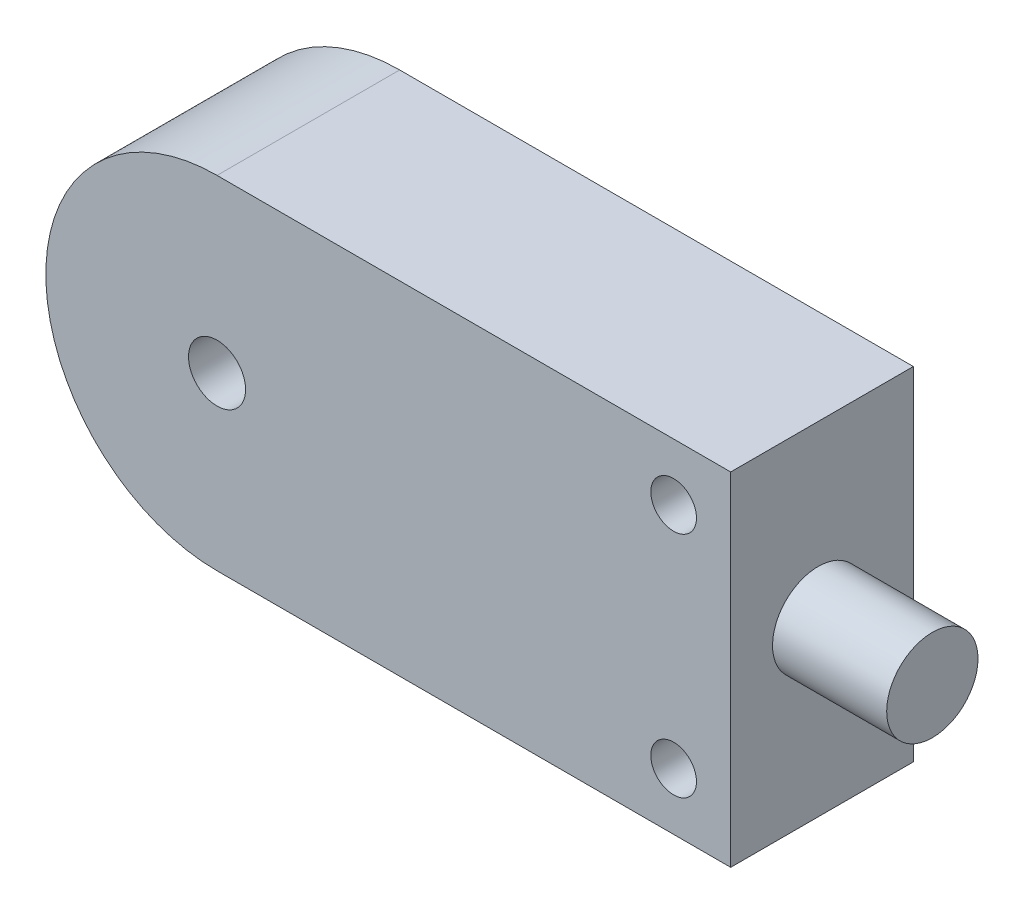
ISO-10303-21;
HEADER;
FILE_DESCRIPTION(('STEP AP214'),'2;1');
FILE_NAME('part.step','',(''),(''),'','','');
FILE_SCHEMA(('AUTOMOTIVE_DESIGN { 1 0 10303 214 1 1 1 1 }'));
ENDSEC;
DATA;
#1=APPLICATION_CONTEXT('core data for automotive mechanical design processes');
#2=APPLICATION_PROTOCOL_DEFINITION('international standard','automotive_design',2000,#1);
#3=PRODUCT_CONTEXT('',#1,'mechanical');
#4=PRODUCT('Part','Part','',(#3));
#5=PRODUCT_RELATED_PRODUCT_CATEGORY('part','',(#4));
#6=PRODUCT_DEFINITION_FORMATION('','',#4);
#7=PRODUCT_DEFINITION_CONTEXT('part definition',#1,'design');
#8=PRODUCT_DEFINITION('design','',#6,#7);
#9=PRODUCT_DEFINITION_SHAPE('','',#8);
#10=(LENGTH_UNIT() NAMED_UNIT(*) SI_UNIT(.MILLI.,.METRE.));
#11=(NAMED_UNIT(*) PLANE_ANGLE_UNIT() SI_UNIT($,.RADIAN.));
#12=(NAMED_UNIT(*) SI_UNIT($,.STERADIAN.) SOLID_ANGLE_UNIT());
#13=UNCERTAINTY_MEASURE_WITH_UNIT(LENGTH_MEASURE(1.E-05),#10,'distance_accuracy_value','');
#14=(GEOMETRIC_REPRESENTATION_CONTEXT(3) GLOBAL_UNCERTAINTY_ASSIGNED_CONTEXT((#13)) GLOBAL_UNIT_ASSIGNED_CONTEXT((#10,
#11,#12)) REPRESENTATION_CONTEXT('',''));
#15=CARTESIAN_POINT('',(0.,0.,0.));
#16=DIRECTION('',(0.,0.,1.));
#17=DIRECTION('',(1.,0.,0.));
#18=AXIS2_PLACEMENT_3D('',#15,#16,#17);
#19=CARTESIAN_POINT('',(45.,15.,16.));
#20=DIRECTION('',(-1.,0.,0.));
#21=DIRECTION('',(0.,-1.,0.));
#22=AXIS2_PLACEMENT_3D('',#19,#20,#21);
#23=PLANE('',#22);
#24=DIRECTION('',(0.,1.,0.));
#25=VECTOR('',#24,1.);
#26=CARTESIAN_POINT('',(45.,15.,0.));
#27=LINE('',#26,#25);
#28=CARTESIAN_POINT('',(45.,-15.,0.));
#29=VERTEX_POINT('',#28);
#30=CARTESIAN_POINT('',(45.,15.,0.));
#31=VERTEX_POINT('',#30);
#32=EDGE_CURVE('E66',#29,#31,#27,.T.);
#33=ORIENTED_EDGE('',*,*,#32,.T.);
#34=DIRECTION('',(0.,0.,-1.));
#35=VECTOR('',#34,1.);
#36=CARTESIAN_POINT('',(45.,15.,16.));
#37=LINE('',#36,#35);
#38=CARTESIAN_POINT('',(45.,15.,16.));
#39=VERTEX_POINT('',#38);
#40=EDGE_CURVE('E92',#39,#31,#37,.T.);
#41=ORIENTED_EDGE('',*,*,#40,.F.);
#42=DIRECTION('',(0.,1.,0.));
#43=VECTOR('',#42,1.);
#44=CARTESIAN_POINT('',(45.,15.,16.));
#45=LINE('',#44,#43);
#46=CARTESIAN_POINT('',(45.,-15.,16.));
#47=VERTEX_POINT('',#46);
#48=EDGE_CURVE('E84',#47,#39,#45,.T.);
#49=ORIENTED_EDGE('',*,*,#48,.F.);
#50=DIRECTION('',(0.,0.,-1.));
#51=VECTOR('',#50,1.);
#52=CARTESIAN_POINT('',(45.,-15.,16.));
#53=LINE('',#52,#51);
#54=EDGE_CURVE('E89',#47,#29,#53,.T.);
#55=ORIENTED_EDGE('',*,*,#54,.T.);
#56=EDGE_LOOP('',(#33,#41,#49,#55));
#57=FACE_BOUND('',#56,.T.);
#58=CARTESIAN_POINT('',(45.,0.,8.33407162694755));
#59=DIRECTION('',(-1.,0.,0.));
#60=DIRECTION('',(0.,-1.,0.));
#61=AXIS2_PLACEMENT_3D('',#58,#59,#60);
#62=CIRCLE('',#61,4.);
#63=CARTESIAN_POINT('',(45.,-3.99999999999999,8.33407162694755));
#64=VERTEX_POINT('',#63);
#65=EDGE_CURVE('E11',#64,#64,#62,.F.);
#66=ORIENTED_EDGE('',*,*,#65,.F.);
#67=EDGE_LOOP('',(#66));
#68=FACE_BOUND('',#67,.T.);
#69=ADVANCED_FACE('F32',(#57,#68),#23,.F.);
#70=CARTESIAN_POINT('',(0.,0.,16.));
#71=DIRECTION('',(0.,0.,1.));
#72=DIRECTION('',(1.,0.,0.));
#73=AXIS2_PLACEMENT_3D('',#70,#71,#72);
#74=PLANE('',#73);
#75=CARTESIAN_POINT('',(40.,-9.99999999999999,16.));
#76=DIRECTION('',(0.,0.,1.));
#77=DIRECTION('',(1.,0.,0.));
#78=AXIS2_PLACEMENT_3D('',#75,#76,#77);
#79=CIRCLE('',#78,2.);
#80=CARTESIAN_POINT('',(42.,-9.99999999999999,16.));
#81=VERTEX_POINT('',#80);
#82=EDGE_CURVE('E133',#81,#81,#79,.T.);
#83=ORIENTED_EDGE('',*,*,#82,.F.);
#84=EDGE_LOOP('',(#83));
#85=FACE_BOUND('',#84,.T.);
#86=CARTESIAN_POINT('',(0.,0.,16.));
#87=DIRECTION('',(0.,0.,1.));
#88=DIRECTION('',(1.,0.,0.));
#89=AXIS2_PLACEMENT_3D('',#86,#87,#88);
#90=CIRCLE('',#89,15.);
#91=CARTESIAN_POINT('',(0.,15.,16.));
#92=VERTEX_POINT('',#91);
#93=CARTESIAN_POINT('',(0.,-15.,16.));
#94=VERTEX_POINT('',#93);
#95=EDGE_CURVE('E86',#92,#94,#90,.T.);
#96=ORIENTED_EDGE('',*,*,#95,.T.);
#97=DIRECTION('',(1.,0.,0.));
#98=VECTOR('',#97,1.);
#99=CARTESIAN_POINT('',(0.,-15.,16.));
#100=LINE('',#99,#98);
#101=EDGE_CURVE('E80',#94,#47,#100,.T.);
#102=ORIENTED_EDGE('',*,*,#101,.T.);
#103=ORIENTED_EDGE('',*,*,#48,.T.);
#104=DIRECTION('',(-1.,0.,0.));
#105=VECTOR('',#104,1.);
#106=CARTESIAN_POINT('',(0.,15.,16.));
#107=LINE('',#106,#105);
#108=EDGE_CURVE('E49',#39,#92,#107,.T.);
#109=ORIENTED_EDGE('',*,*,#108,.T.);
#110=EDGE_LOOP('',(#96,#102,#103,#109));
#111=FACE_BOUND('',#110,.T.);
#112=CARTESIAN_POINT('',(40.,9.99999999999999,16.));
#113=DIRECTION('',(0.,0.,1.));
#114=DIRECTION('',(1.,0.,0.));
#115=AXIS2_PLACEMENT_3D('',#112,#113,#114);
#116=CIRCLE('',#115,2.);
#117=CARTESIAN_POINT('',(42.,9.99999999999999,16.));
#118=VERTEX_POINT('',#117);
#119=EDGE_CURVE('E103',#118,#118,#116,.T.);
#120=ORIENTED_EDGE('',*,*,#119,.F.);
#121=EDGE_LOOP('',(#120));
#122=FACE_BOUND('',#121,.T.);
#123=CARTESIAN_POINT('',(0.,0.,16.));
#124=DIRECTION('',(0.,0.,1.));
#125=DIRECTION('',(1.,0.,0.));
#126=AXIS2_PLACEMENT_3D('',#123,#124,#125);
#127=CIRCLE('',#126,2.5);
#128=CARTESIAN_POINT('',(2.5,0.,16.));
#129=VERTEX_POINT('',#128);
#130=EDGE_CURVE('E124',#129,#129,#127,.T.);
#131=ORIENTED_EDGE('',*,*,#130,.F.);
#132=EDGE_LOOP('',(#131));
#133=FACE_BOUND('',#132,.T.);
#134=ADVANCED_FACE('F81',(#85,#111,#122,#133),#74,.T.);
#135=CARTESIAN_POINT('',(0.,0.,0.));
#136=DIRECTION('',(0.,0.,1.));
#137=DIRECTION('',(1.,0.,0.));
#138=AXIS2_PLACEMENT_3D('',#135,#136,#137);
#139=PLANE('',#138);
#140=CARTESIAN_POINT('',(40.,-9.99999999999999,0.));
#141=DIRECTION('',(0.,0.,1.));
#142=DIRECTION('',(1.,0.,0.));
#143=AXIS2_PLACEMENT_3D('',#140,#141,#142);
#144=CIRCLE('',#143,2.);
#145=CARTESIAN_POINT('',(42.,-9.99999999999999,0.));
#146=VERTEX_POINT('',#145);
#147=EDGE_CURVE('E128',#146,#146,#144,.T.);
#148=ORIENTED_EDGE('',*,*,#147,.T.);
#149=EDGE_LOOP('',(#148));
#150=FACE_BOUND('',#149,.T.);
#151=CARTESIAN_POINT('',(0.,0.,0.));
#152=DIRECTION('',(0.,0.,1.));
#153=DIRECTION('',(1.,0.,0.));
#154=AXIS2_PLACEMENT_3D('',#151,#152,#153);
#155=CIRCLE('',#154,15.);
#156=CARTESIAN_POINT('',(0.,15.,0.));
#157=VERTEX_POINT('',#156);
#158=CARTESIAN_POINT('',(0.,-15.,0.));
#159=VERTEX_POINT('',#158);
#160=EDGE_CURVE('E100',#157,#159,#155,.T.);
#161=ORIENTED_EDGE('',*,*,#160,.F.);
#162=DIRECTION('',(-1.,0.,0.));
#163=VECTOR('',#162,1.);
#164=CARTESIAN_POINT('',(0.,15.,0.));
#165=LINE('',#164,#163);
#166=EDGE_CURVE('E72',#31,#157,#165,.T.);
#167=ORIENTED_EDGE('',*,*,#166,.F.);
#168=ORIENTED_EDGE('',*,*,#32,.F.);
#169=DIRECTION('',(1.,0.,0.));
#170=VECTOR('',#169,1.);
#171=CARTESIAN_POINT('',(0.,-15.,0.));
#172=LINE('',#171,#170);
#173=EDGE_CURVE('E91',#159,#29,#172,.T.);
#174=ORIENTED_EDGE('',*,*,#173,.F.);
#175=EDGE_LOOP('',(#161,#167,#168,#174));
#176=FACE_BOUND('',#175,.T.);
#177=CARTESIAN_POINT('',(40.,9.99999999999999,0.));
#178=DIRECTION('',(0.,0.,1.));
#179=DIRECTION('',(1.,0.,0.));
#180=AXIS2_PLACEMENT_3D('',#177,#178,#179);
#181=CIRCLE('',#180,2.);
#182=CARTESIAN_POINT('',(42.,9.99999999999999,0.));
#183=VERTEX_POINT('',#182);
#184=EDGE_CURVE('E119',#183,#183,#181,.T.);
#185=ORIENTED_EDGE('',*,*,#184,.T.);
#186=EDGE_LOOP('',(#185));
#187=FACE_BOUND('',#186,.T.);
#188=CARTESIAN_POINT('',(0.,0.,0.));
#189=DIRECTION('',(0.,0.,1.));
#190=DIRECTION('',(1.,0.,0.));
#191=AXIS2_PLACEMENT_3D('',#188,#189,#190);
#192=CIRCLE('',#191,2.5);
#193=CARTESIAN_POINT('',(2.5,0.,0.));
#194=VERTEX_POINT('',#193);
#195=EDGE_CURVE('E122',#194,#194,#192,.T.);
#196=ORIENTED_EDGE('',*,*,#195,.T.);
#197=EDGE_LOOP('',(#196));
#198=FACE_BOUND('',#197,.T.);
#199=ADVANCED_FACE('F111',(#150,#176,#187,#198),#139,.F.);
#200=CARTESIAN_POINT('',(0.,0.,16.));
#201=DIRECTION('',(0.,0.,-1.));
#202=DIRECTION('',(-1.,0.,0.));
#203=AXIS2_PLACEMENT_3D('',#200,#201,#202);
#204=CYLINDRICAL_SURFACE('',#203,15.);
#205=ORIENTED_EDGE('',*,*,#160,.T.);
#206=DIRECTION('',(0.,0.,-1.));
#207=VECTOR('',#206,1.);
#208=CARTESIAN_POINT('',(0.,-15.,16.));
#209=LINE('',#208,#207);
#210=EDGE_CURVE('E41',#94,#159,#209,.T.);
#211=ORIENTED_EDGE('',*,*,#210,.F.);
#212=ORIENTED_EDGE('',*,*,#95,.F.);
#213=DIRECTION('',(0.,0.,-1.));
#214=VECTOR('',#213,1.);
#215=CARTESIAN_POINT('',(0.,15.,16.));
#216=LINE('',#215,#214);
#217=EDGE_CURVE('E96',#92,#157,#216,.T.);
#218=ORIENTED_EDGE('',*,*,#217,.T.);
#219=EDGE_LOOP('',(#205,#211,#212,#218));
#220=FACE_BOUND('',#219,.T.);
#221=ADVANCED_FACE('F34',(#220),#204,.T.);
#222=CARTESIAN_POINT('',(0.,-15.,16.));
#223=DIRECTION('',(0.,1.,0.));
#224=DIRECTION('',(0.,0.,1.));
#225=AXIS2_PLACEMENT_3D('',#222,#223,#224);
#226=PLANE('',#225);
#227=ORIENTED_EDGE('',*,*,#173,.T.);
#228=ORIENTED_EDGE('',*,*,#54,.F.);
#229=ORIENTED_EDGE('',*,*,#101,.F.);
#230=ORIENTED_EDGE('',*,*,#210,.T.);
#231=EDGE_LOOP('',(#227,#228,#229,#230));
#232=FACE_BOUND('',#231,.T.);
#233=ADVANCED_FACE('F90',(#232),#226,.F.);
#234=CARTESIAN_POINT('',(0.,15.,16.));
#235=DIRECTION('',(0.,-1.,0.));
#236=DIRECTION('',(0.,0.,-1.));
#237=AXIS2_PLACEMENT_3D('',#234,#235,#236);
#238=PLANE('',#237);
#239=ORIENTED_EDGE('',*,*,#166,.T.);
#240=ORIENTED_EDGE('',*,*,#217,.F.);
#241=ORIENTED_EDGE('',*,*,#108,.F.);
#242=ORIENTED_EDGE('',*,*,#40,.T.);
#243=EDGE_LOOP('',(#239,#240,#241,#242));
#244=FACE_BOUND('',#243,.T.);
#245=ADVANCED_FACE('F169',(#244),#238,.F.);
#246=CARTESIAN_POINT('',(40.,9.99999999999999,16.));
#247=DIRECTION('',(0.,0.,-1.));
#248=DIRECTION('',(-1.,0.,0.));
#249=AXIS2_PLACEMENT_3D('',#246,#247,#248);
#250=CYLINDRICAL_SURFACE('',#249,2.);
#251=ORIENTED_EDGE('',*,*,#119,.T.);
#252=EDGE_LOOP('',(#251));
#253=FACE_BOUND('',#252,.T.);
#254=ORIENTED_EDGE('',*,*,#184,.F.);
#255=EDGE_LOOP('',(#254));
#256=FACE_BOUND('',#255,.T.);
#257=ADVANCED_FACE('F142',(#253,#256),#250,.F.);
#258=CARTESIAN_POINT('',(40.,-9.99999999999999,16.));
#259=DIRECTION('',(0.,0.,-1.));
#260=DIRECTION('',(-1.,0.,0.));
#261=AXIS2_PLACEMENT_3D('',#258,#259,#260);
#262=CYLINDRICAL_SURFACE('',#261,2.);
#263=ORIENTED_EDGE('',*,*,#82,.T.);
#264=EDGE_LOOP('',(#263));
#265=FACE_BOUND('',#264,.T.);
#266=ORIENTED_EDGE('',*,*,#147,.F.);
#267=EDGE_LOOP('',(#266));
#268=FACE_BOUND('',#267,.T.);
#269=ADVANCED_FACE('F153',(#265,#268),#262,.F.);
#270=CARTESIAN_POINT('',(0.,0.,16.));
#271=DIRECTION('',(0.,0.,-1.));
#272=DIRECTION('',(-1.,0.,0.));
#273=AXIS2_PLACEMENT_3D('',#270,#271,#272);
#274=CYLINDRICAL_SURFACE('',#273,2.5);
#275=ORIENTED_EDGE('',*,*,#130,.T.);
#276=EDGE_LOOP('',(#275));
#277=FACE_BOUND('',#276,.T.);
#278=ORIENTED_EDGE('',*,*,#195,.F.);
#279=EDGE_LOOP('',(#278));
#280=FACE_BOUND('',#279,.T.);
#281=ADVANCED_FACE('F150',(#277,#280),#274,.F.);
#282=CARTESIAN_POINT('',(55.,0.,8.33407162694755));
#283=DIRECTION('',(-1.,0.,0.));
#284=DIRECTION('',(0.,-1.,0.));
#285=AXIS2_PLACEMENT_3D('',#282,#283,#284);
#286=CYLINDRICAL_SURFACE('',#285,4.);
#287=CARTESIAN_POINT('',(55.,0.,8.33407162694755));
#288=DIRECTION('',(1.,0.,0.));
#289=DIRECTION('',(0.,1.,0.));
#290=AXIS2_PLACEMENT_3D('',#287,#288,#289);
#291=CIRCLE('',#290,4.);
#292=CARTESIAN_POINT('',(55.,4.00000000000002,8.33407162694755));
#293=VERTEX_POINT('',#292);
#294=EDGE_CURVE('E125',#293,#293,#291,.T.);
#295=ORIENTED_EDGE('',*,*,#294,.F.);
#296=EDGE_LOOP('',(#295));
#297=FACE_BOUND('',#296,.T.);
#298=ORIENTED_EDGE('',*,*,#65,.T.);
#299=EDGE_LOOP('',(#298));
#300=FACE_BOUND('',#299,.T.);
#301=ADVANCED_FACE('F152',(#297,#300),#286,.T.);
#302=CARTESIAN_POINT('',(55.,0.,8.33407162694755));
#303=DIRECTION('',(1.,0.,0.));
#304=DIRECTION('',(0.,1.,0.));
#305=AXIS2_PLACEMENT_3D('',#302,#303,#304);
#306=PLANE('',#305);
#307=ORIENTED_EDGE('',*,*,#294,.T.);
#308=EDGE_LOOP('',(#307));
#309=FACE_BOUND('',#308,.T.);
#310=ADVANCED_FACE('F159',(#309),#306,.T.);
#311=CLOSED_SHELL('',(#69,#134,#199,#221,#233,#245,#257,#269,#281,#301,#310));
#312=MANIFOLD_SOLID_BREP('B2',#311);
#313=ADVANCED_BREP_SHAPE_REPRESENTATION('',(#18,#312),#14);
#314=SHAPE_DEFINITION_REPRESENTATION(#9,#313);
ENDSEC;
END-ISO-10303-21;
